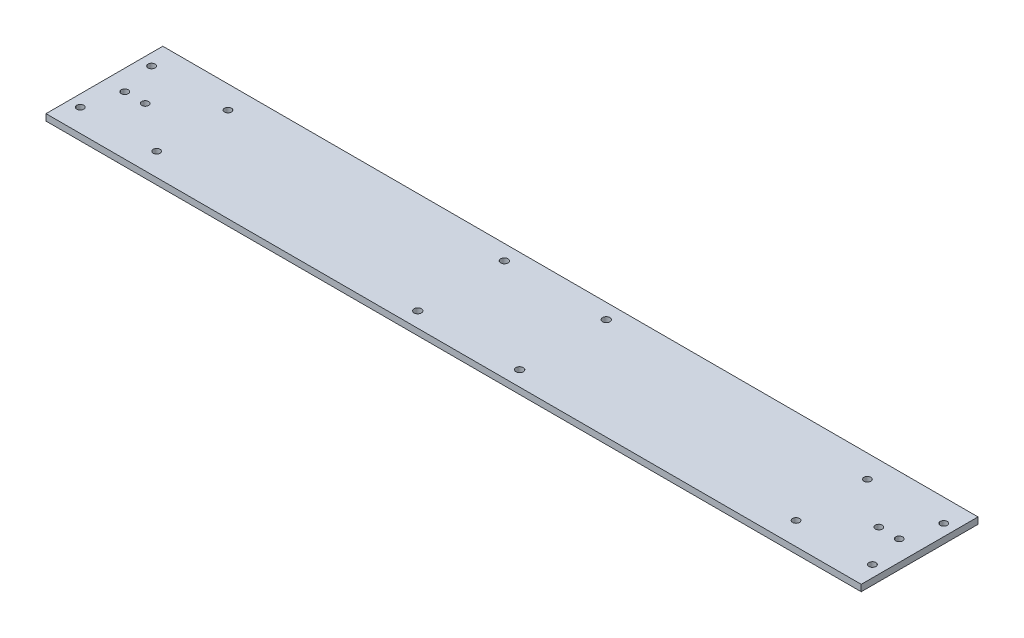
ISO-10303-21;
HEADER;
FILE_DESCRIPTION(('STEP AP214'),'2;1');
FILE_NAME('part.step','',(''),(''),'','','');
FILE_SCHEMA(('AUTOMOTIVE_DESIGN { 1 0 10303 214 1 1 1 1 }'));
ENDSEC;
DATA;
#1=APPLICATION_CONTEXT('core data for automotive mechanical design processes');
#2=APPLICATION_PROTOCOL_DEFINITION('international standard','automotive_design',2000,#1);
#3=PRODUCT_CONTEXT('',#1,'mechanical');
#4=PRODUCT('Part','Part','',(#3));
#5=PRODUCT_RELATED_PRODUCT_CATEGORY('part','',(#4));
#6=PRODUCT_DEFINITION_FORMATION('','',#4);
#7=PRODUCT_DEFINITION_CONTEXT('part definition',#1,'design');
#8=PRODUCT_DEFINITION('design','',#6,#7);
#9=PRODUCT_DEFINITION_SHAPE('','',#8);
#10=(LENGTH_UNIT() NAMED_UNIT(*) SI_UNIT(.MILLI.,.METRE.));
#11=(NAMED_UNIT(*) PLANE_ANGLE_UNIT() SI_UNIT($,.RADIAN.));
#12=(NAMED_UNIT(*) SI_UNIT($,.STERADIAN.) SOLID_ANGLE_UNIT());
#13=UNCERTAINTY_MEASURE_WITH_UNIT(LENGTH_MEASURE(1.E-05),#10,'distance_accuracy_value','');
#14=(GEOMETRIC_REPRESENTATION_CONTEXT(3) GLOBAL_UNCERTAINTY_ASSIGNED_CONTEXT((#13)) GLOBAL_UNIT_ASSIGNED_CONTEXT((#10,
#11,#12)) REPRESENTATION_CONTEXT('',''));
#15=CARTESIAN_POINT('',(0.,0.,0.));
#16=DIRECTION('',(0.,0.,1.));
#17=DIRECTION('',(1.,0.,0.));
#18=AXIS2_PLACEMENT_3D('',#15,#16,#17);
#19=CARTESIAN_POINT('',(200.,3.175,-28.65));
#20=DIRECTION('',(-1.,0.,0.));
#21=DIRECTION('',(0.,0.,1.));
#22=AXIS2_PLACEMENT_3D('',#19,#20,#21);
#23=PLANE('',#22);
#24=DIRECTION('',(0.,0.,-1.));
#25=VECTOR('',#24,1.);
#26=CARTESIAN_POINT('',(200.,0.,-28.65));
#27=LINE('',#26,#25);
#28=CARTESIAN_POINT('',(200.,0.,28.65));
#29=VERTEX_POINT('',#28);
#30=CARTESIAN_POINT('',(200.,0.,-28.65));
#31=VERTEX_POINT('',#30);
#32=EDGE_CURVE('E138',#29,#31,#27,.T.);
#33=ORIENTED_EDGE('',*,*,#32,.T.);
#34=DIRECTION('',(0.,-1.,0.));
#35=VECTOR('',#34,1.);
#36=CARTESIAN_POINT('',(200.,3.175,-28.65));
#37=LINE('',#36,#35);
#38=CARTESIAN_POINT('',(200.,3.175,-28.65));
#39=VERTEX_POINT('',#38);
#40=EDGE_CURVE('E12',#39,#31,#37,.T.);
#41=ORIENTED_EDGE('',*,*,#40,.F.);
#42=DIRECTION('',(0.,0.,-1.));
#43=VECTOR('',#42,1.);
#44=CARTESIAN_POINT('',(200.,3.175,-28.65));
#45=LINE('',#44,#43);
#46=CARTESIAN_POINT('',(200.,3.175,28.65));
#47=VERTEX_POINT('',#46);
#48=EDGE_CURVE('E100',#47,#39,#45,.T.);
#49=ORIENTED_EDGE('',*,*,#48,.F.);
#50=DIRECTION('',(0.,-1.,0.));
#51=VECTOR('',#50,1.);
#52=CARTESIAN_POINT('',(200.,3.175,28.65));
#53=LINE('',#52,#51);
#54=EDGE_CURVE('E115',#47,#29,#53,.T.);
#55=ORIENTED_EDGE('',*,*,#54,.T.);
#56=EDGE_LOOP('',(#33,#41,#49,#55));
#57=FACE_BOUND('',#56,.T.);
#58=ADVANCED_FACE('F41',(#57),#23,.F.);
#59=CARTESIAN_POINT('',(-200.,3.175,-28.65));
#60=DIRECTION('',(0.,0.,1.));
#61=DIRECTION('',(1.,0.,0.));
#62=AXIS2_PLACEMENT_3D('',#59,#60,#61);
#63=PLANE('',#62);
#64=DIRECTION('',(-1.,0.,0.));
#65=VECTOR('',#64,1.);
#66=CARTESIAN_POINT('',(-200.,0.,-28.65));
#67=LINE('',#66,#65);
#68=CARTESIAN_POINT('',(-200.,0.,-28.65));
#69=VERTEX_POINT('',#68);
#70=EDGE_CURVE('E105',#31,#69,#67,.T.);
#71=ORIENTED_EDGE('',*,*,#70,.T.);
#72=DIRECTION('',(0.,-1.,0.));
#73=VECTOR('',#72,1.);
#74=CARTESIAN_POINT('',(-200.,3.175,-28.65));
#75=LINE('',#74,#73);
#76=CARTESIAN_POINT('',(-200.,3.175,-28.65));
#77=VERTEX_POINT('',#76);
#78=EDGE_CURVE('E51',#77,#69,#75,.T.);
#79=ORIENTED_EDGE('',*,*,#78,.F.);
#80=DIRECTION('',(-1.,0.,0.));
#81=VECTOR('',#80,1.);
#82=CARTESIAN_POINT('',(-200.,3.175,-28.65));
#83=LINE('',#82,#81);
#84=EDGE_CURVE('E95',#39,#77,#83,.T.);
#85=ORIENTED_EDGE('',*,*,#84,.F.);
#86=ORIENTED_EDGE('',*,*,#40,.T.);
#87=EDGE_LOOP('',(#71,#79,#85,#86));
#88=FACE_BOUND('',#87,.T.);
#89=ADVANCED_FACE('F104',(#88),#63,.F.);
#90=CARTESIAN_POINT('',(-200.,3.175,-28.65));
#91=DIRECTION('',(1.,0.,0.));
#92=DIRECTION('',(0.,0.,-1.));
#93=AXIS2_PLACEMENT_3D('',#90,#91,#92);
#94=PLANE('',#93);
#95=DIRECTION('',(0.,0.,1.));
#96=VECTOR('',#95,1.);
#97=CARTESIAN_POINT('',(-200.,0.,-28.65));
#98=LINE('',#97,#96);
#99=CARTESIAN_POINT('',(-200.,0.,28.65));
#100=VERTEX_POINT('',#99);
#101=EDGE_CURVE('E81',#69,#100,#98,.T.);
#102=ORIENTED_EDGE('',*,*,#101,.T.);
#103=DIRECTION('',(0.,-1.,0.));
#104=VECTOR('',#103,1.);
#105=CARTESIAN_POINT('',(-200.,3.175,28.65));
#106=LINE('',#105,#104);
#107=CARTESIAN_POINT('',(-200.,3.175,28.65));
#108=VERTEX_POINT('',#107);
#109=EDGE_CURVE('E107',#108,#100,#106,.T.);
#110=ORIENTED_EDGE('',*,*,#109,.F.);
#111=DIRECTION('',(0.,0.,1.));
#112=VECTOR('',#111,1.);
#113=CARTESIAN_POINT('',(-200.,3.175,-28.65));
#114=LINE('',#113,#112);
#115=EDGE_CURVE('E98',#77,#108,#114,.T.);
#116=ORIENTED_EDGE('',*,*,#115,.F.);
#117=ORIENTED_EDGE('',*,*,#78,.T.);
#118=EDGE_LOOP('',(#102,#110,#116,#117));
#119=FACE_BOUND('',#118,.T.);
#120=ADVANCED_FACE('F109',(#119),#94,.F.);
#121=CARTESIAN_POINT('',(-200.,3.175,28.65));
#122=DIRECTION('',(0.,0.,-1.));
#123=DIRECTION('',(-1.,0.,0.));
#124=AXIS2_PLACEMENT_3D('',#121,#122,#123);
#125=PLANE('',#124);
#126=DIRECTION('',(1.,0.,0.));
#127=VECTOR('',#126,1.);
#128=CARTESIAN_POINT('',(-200.,0.,28.65));
#129=LINE('',#128,#127);
#130=EDGE_CURVE('E87',#100,#29,#129,.T.);
#131=ORIENTED_EDGE('',*,*,#130,.T.);
#132=ORIENTED_EDGE('',*,*,#54,.F.);
#133=DIRECTION('',(1.,0.,0.));
#134=VECTOR('',#133,1.);
#135=CARTESIAN_POINT('',(-200.,3.175,28.65));
#136=LINE('',#135,#134);
#137=EDGE_CURVE('E60',#108,#47,#136,.T.);
#138=ORIENTED_EDGE('',*,*,#137,.F.);
#139=ORIENTED_EDGE('',*,*,#109,.T.);
#140=EDGE_LOOP('',(#131,#132,#138,#139));
#141=FACE_BOUND('',#140,.T.);
#142=ADVANCED_FACE('F259',(#141),#125,.F.);
#143=CARTESIAN_POINT('',(0.,3.175,0.));
#144=DIRECTION('',(0.,1.,0.));
#145=DIRECTION('',(0.,0.,1.));
#146=AXIS2_PLACEMENT_3D('',#143,#144,#145);
#147=PLANE('',#146);
#148=CARTESIAN_POINT('',(25.,3.175,21.25));
#149=DIRECTION('',(0.,1.,0.));
#150=DIRECTION('',(0.,0.,1.));
#151=AXIS2_PLACEMENT_3D('',#148,#149,#150);
#152=CIRCLE('',#151,1.79999999999999);
#153=CARTESIAN_POINT('',(25.,3.175,23.05));
#154=VERTEX_POINT('',#153);
#155=EDGE_CURVE('E323',#154,#154,#152,.T.);
#156=ORIENTED_EDGE('',*,*,#155,.F.);
#157=EDGE_LOOP('',(#156));
#158=FACE_BOUND('',#157,.T.);
#159=CARTESIAN_POINT('',(-25.,3.175,-21.25));
#160=DIRECTION('',(0.,1.,0.));
#161=DIRECTION('',(0.,0.,1.));
#162=AXIS2_PLACEMENT_3D('',#159,#160,#161);
#163=CIRCLE('',#162,1.79999999999999);
#164=CARTESIAN_POINT('',(-25.,3.175,-19.45));
#165=VERTEX_POINT('',#164);
#166=EDGE_CURVE('E309',#165,#165,#163,.T.);
#167=ORIENTED_EDGE('',*,*,#166,.F.);
#168=EDGE_LOOP('',(#167));
#169=FACE_BOUND('',#168,.T.);
#170=CARTESIAN_POINT('',(-25.,3.175,21.25));
#171=DIRECTION('',(0.,1.,0.));
#172=DIRECTION('',(0.,0.,1.));
#173=AXIS2_PLACEMENT_3D('',#170,#171,#172);
#174=CIRCLE('',#173,1.79999999999999);
#175=CARTESIAN_POINT('',(-25.,3.175,23.05));
#176=VERTEX_POINT('',#175);
#177=EDGE_CURVE('E305',#176,#176,#174,.T.);
#178=ORIENTED_EDGE('',*,*,#177,.F.);
#179=EDGE_LOOP('',(#178));
#180=FACE_BOUND('',#179,.T.);
#181=CARTESIAN_POINT('',(25.,3.175,-21.25));
#182=DIRECTION('',(0.,1.,0.));
#183=DIRECTION('',(0.,0.,1.));
#184=AXIS2_PLACEMENT_3D('',#181,#182,#183);
#185=CIRCLE('',#184,1.79999999999999);
#186=CARTESIAN_POINT('',(25.,3.175,-19.45));
#187=VERTEX_POINT('',#186);
#188=EDGE_CURVE('E304',#187,#187,#185,.T.);
#189=ORIENTED_EDGE('',*,*,#188,.F.);
#190=EDGE_LOOP('',(#189));
#191=FACE_BOUND('',#190,.T.);
#192=CARTESIAN_POINT('',(194.33820754717,3.175,17.5));
#193=DIRECTION('',(0.,1.,0.));
#194=DIRECTION('',(0.,0.,1.));
#195=AXIS2_PLACEMENT_3D('',#192,#193,#194);
#196=CIRCLE('',#195,1.70000000000001);
#197=CARTESIAN_POINT('',(194.33820754717,3.175,19.2));
#198=VERTEX_POINT('',#197);
#199=EDGE_CURVE('E236',#198,#198,#196,.T.);
#200=ORIENTED_EDGE('',*,*,#199,.F.);
#201=EDGE_LOOP('',(#200));
#202=FACE_BOUND('',#201,.T.);
#203=CARTESIAN_POINT('',(156.86179245283,3.175,17.5));
#204=DIRECTION('',(0.,1.,0.));
#205=DIRECTION('',(0.,0.,1.));
#206=AXIS2_PLACEMENT_3D('',#203,#204,#205);
#207=CIRCLE('',#206,1.70000000000001);
#208=CARTESIAN_POINT('',(156.86179245283,3.175,19.2));
#209=VERTEX_POINT('',#208);
#210=EDGE_CURVE('E229',#209,#209,#207,.T.);
#211=ORIENTED_EDGE('',*,*,#210,.F.);
#212=EDGE_LOOP('',(#211));
#213=FACE_BOUND('',#212,.T.);
#214=CARTESIAN_POINT('',(156.86179245283,3.175,-17.5));
#215=DIRECTION('',(0.,1.,0.));
#216=DIRECTION('',(0.,0.,1.));
#217=AXIS2_PLACEMENT_3D('',#214,#215,#216);
#218=CIRCLE('',#217,1.70000000000001);
#219=CARTESIAN_POINT('',(156.86179245283,3.175,-15.8));
#220=VERTEX_POINT('',#219);
#221=EDGE_CURVE('E219',#220,#220,#218,.T.);
#222=ORIENTED_EDGE('',*,*,#221,.F.);
#223=EDGE_LOOP('',(#222));
#224=FACE_BOUND('',#223,.T.);
#225=CARTESIAN_POINT('',(-156.86179245283,3.175,-17.5));
#226=DIRECTION('',(0.,1.,0.));
#227=DIRECTION('',(0.,0.,1.));
#228=AXIS2_PLACEMENT_3D('',#225,#226,#227);
#229=CIRCLE('',#228,1.70000000000001);
#230=CARTESIAN_POINT('',(-156.86179245283,3.175,-15.8));
#231=VERTEX_POINT('',#230);
#232=EDGE_CURVE('E210',#231,#231,#229,.T.);
#233=ORIENTED_EDGE('',*,*,#232,.F.);
#234=EDGE_LOOP('',(#233));
#235=FACE_BOUND('',#234,.T.);
#236=CARTESIAN_POINT('',(-156.86179245283,3.175,17.5));
#237=DIRECTION('',(0.,1.,0.));
#238=DIRECTION('',(0.,0.,1.));
#239=AXIS2_PLACEMENT_3D('',#236,#237,#238);
#240=CIRCLE('',#239,1.70000000000001);
#241=CARTESIAN_POINT('',(-156.86179245283,3.175,19.2));
#242=VERTEX_POINT('',#241);
#243=EDGE_CURVE('E139',#242,#242,#240,.T.);
#244=ORIENTED_EDGE('',*,*,#243,.F.);
#245=EDGE_LOOP('',(#244));
#246=FACE_BOUND('',#245,.T.);
#247=CARTESIAN_POINT('',(-180.,3.175,3.97922587803469E-09));
#248=DIRECTION('',(0.,1.,0.));
#249=DIRECTION('',(0.,0.,1.));
#250=AXIS2_PLACEMENT_3D('',#247,#248,#249);
#251=CIRCLE('',#250,1.69999999999998);
#252=CARTESIAN_POINT('',(-180.,3.175,1.70000000397921));
#253=VERTEX_POINT('',#252);
#254=EDGE_CURVE('E155',#253,#253,#251,.T.);
#255=ORIENTED_EDGE('',*,*,#254,.F.);
#256=EDGE_LOOP('',(#255));
#257=FACE_BOUND('',#256,.T.);
#258=CARTESIAN_POINT('',(-190.,3.175,3.97922434722619E-09));
#259=DIRECTION('',(0.,1.,0.));
#260=DIRECTION('',(0.,0.,1.));
#261=AXIS2_PLACEMENT_3D('',#258,#259,#260);
#262=CIRCLE('',#261,1.69999999999998);
#263=CARTESIAN_POINT('',(-190.,3.175,1.70000000397921));
#264=VERTEX_POINT('',#263);
#265=EDGE_CURVE('E163',#264,#264,#262,.T.);
#266=ORIENTED_EDGE('',*,*,#265,.F.);
#267=EDGE_LOOP('',(#266));
#268=FACE_BOUND('',#267,.T.);
#269=CARTESIAN_POINT('',(-194.338207547169,3.175,-17.5));
#270=DIRECTION('',(0.,1.,0.));
#271=DIRECTION('',(0.,0.,1.));
#272=AXIS2_PLACEMENT_3D('',#269,#270,#271);
#273=CIRCLE('',#272,1.70000000000001);
#274=CARTESIAN_POINT('',(-194.338207547169,3.175,-15.8));
#275=VERTEX_POINT('',#274);
#276=EDGE_CURVE('E172',#275,#275,#273,.T.);
#277=ORIENTED_EDGE('',*,*,#276,.F.);
#278=EDGE_LOOP('',(#277));
#279=FACE_BOUND('',#278,.T.);
#280=CARTESIAN_POINT('',(180.,3.175,-3.97921373497036E-09));
#281=DIRECTION('',(0.,1.,0.));
#282=DIRECTION('',(0.,0.,1.));
#283=AXIS2_PLACEMENT_3D('',#280,#281,#282);
#284=CIRCLE('',#283,1.69999999999998);
#285=CARTESIAN_POINT('',(180.,3.175,1.69999999602077));
#286=VERTEX_POINT('',#285);
#287=EDGE_CURVE('E182',#286,#286,#284,.T.);
#288=ORIENTED_EDGE('',*,*,#287,.F.);
#289=EDGE_LOOP('',(#288));
#290=FACE_BOUND('',#289,.T.);
#291=CARTESIAN_POINT('',(190.,3.175,-3.97921220416186E-09));
#292=DIRECTION('',(0.,1.,0.));
#293=DIRECTION('',(0.,0.,1.));
#294=AXIS2_PLACEMENT_3D('',#291,#292,#293);
#295=CIRCLE('',#294,1.69999999999998);
#296=CARTESIAN_POINT('',(190.,3.175,1.69999999602077));
#297=VERTEX_POINT('',#296);
#298=EDGE_CURVE('E193',#297,#297,#295,.T.);
#299=ORIENTED_EDGE('',*,*,#298,.F.);
#300=EDGE_LOOP('',(#299));
#301=FACE_BOUND('',#300,.T.);
#302=CARTESIAN_POINT('',(194.33820754717,3.175,-17.5));
#303=DIRECTION('',(0.,1.,0.));
#304=DIRECTION('',(0.,0.,1.));
#305=AXIS2_PLACEMENT_3D('',#302,#303,#304);
#306=CIRCLE('',#305,1.70000000000001);
#307=CARTESIAN_POINT('',(194.33820754717,3.175,-15.8));
#308=VERTEX_POINT('',#307);
#309=EDGE_CURVE('E202',#308,#308,#306,.T.);
#310=ORIENTED_EDGE('',*,*,#309,.F.);
#311=EDGE_LOOP('',(#310));
#312=FACE_BOUND('',#311,.T.);
#313=CARTESIAN_POINT('',(-194.338207547169,3.175,17.5));
#314=DIRECTION('',(0.,1.,0.));
#315=DIRECTION('',(0.,0.,1.));
#316=AXIS2_PLACEMENT_3D('',#313,#314,#315);
#317=CIRCLE('',#316,1.70000000000001);
#318=CARTESIAN_POINT('',(-194.338207547169,3.175,19.2));
#319=VERTEX_POINT('',#318);
#320=EDGE_CURVE('E128',#319,#319,#317,.T.);
#321=ORIENTED_EDGE('',*,*,#320,.F.);
#322=EDGE_LOOP('',(#321));
#323=FACE_BOUND('',#322,.T.);
#324=ORIENTED_EDGE('',*,*,#48,.T.);
#325=ORIENTED_EDGE('',*,*,#84,.T.);
#326=ORIENTED_EDGE('',*,*,#115,.T.);
#327=ORIENTED_EDGE('',*,*,#137,.T.);
#328=EDGE_LOOP('',(#324,#325,#326,#327));
#329=FACE_BOUND('',#328,.T.);
#330=ADVANCED_FACE('F96',(#158,#169,#180,#191,#202,#213,#224,#235,#246,#257,#268,#279,#290,#301,
#312,#323,#329),#147,.T.);
#331=CARTESIAN_POINT('',(0.,0.,0.));
#332=DIRECTION('',(0.,1.,0.));
#333=DIRECTION('',(0.,0.,1.));
#334=AXIS2_PLACEMENT_3D('',#331,#332,#333);
#335=PLANE('',#334);
#336=CARTESIAN_POINT('',(25.,0.,21.25));
#337=DIRECTION('',(0.,1.,0.));
#338=DIRECTION('',(0.,0.,1.));
#339=AXIS2_PLACEMENT_3D('',#336,#337,#338);
#340=CIRCLE('',#339,1.79999999999999);
#341=CARTESIAN_POINT('',(25.,0.,23.05));
#342=VERTEX_POINT('',#341);
#343=EDGE_CURVE('E44',#342,#342,#340,.T.);
#344=ORIENTED_EDGE('',*,*,#343,.T.);
#345=EDGE_LOOP('',(#344));
#346=FACE_BOUND('',#345,.T.);
#347=CARTESIAN_POINT('',(-25.,0.,-21.25));
#348=DIRECTION('',(0.,1.,0.));
#349=DIRECTION('',(0.,0.,1.));
#350=AXIS2_PLACEMENT_3D('',#347,#348,#349);
#351=CIRCLE('',#350,1.79999999999999);
#352=CARTESIAN_POINT('',(-25.,0.,-19.45));
#353=VERTEX_POINT('',#352);
#354=EDGE_CURVE('E306',#353,#353,#351,.T.);
#355=ORIENTED_EDGE('',*,*,#354,.T.);
#356=EDGE_LOOP('',(#355));
#357=FACE_BOUND('',#356,.T.);
#358=CARTESIAN_POINT('',(-25.,0.,21.25));
#359=DIRECTION('',(0.,1.,0.));
#360=DIRECTION('',(0.,0.,1.));
#361=AXIS2_PLACEMENT_3D('',#358,#359,#360);
#362=CIRCLE('',#361,1.79999999999999);
#363=CARTESIAN_POINT('',(-25.,0.,23.05));
#364=VERTEX_POINT('',#363);
#365=EDGE_CURVE('E301',#364,#364,#362,.T.);
#366=ORIENTED_EDGE('',*,*,#365,.T.);
#367=EDGE_LOOP('',(#366));
#368=FACE_BOUND('',#367,.T.);
#369=CARTESIAN_POINT('',(25.,0.,-21.25));
#370=DIRECTION('',(0.,1.,0.));
#371=DIRECTION('',(0.,0.,1.));
#372=AXIS2_PLACEMENT_3D('',#369,#370,#371);
#373=CIRCLE('',#372,1.79999999999999);
#374=CARTESIAN_POINT('',(25.,0.,-19.45));
#375=VERTEX_POINT('',#374);
#376=EDGE_CURVE('E207',#375,#375,#373,.T.);
#377=ORIENTED_EDGE('',*,*,#376,.T.);
#378=EDGE_LOOP('',(#377));
#379=FACE_BOUND('',#378,.T.);
#380=CARTESIAN_POINT('',(194.33820754717,0.,17.5));
#381=DIRECTION('',(0.,1.,0.));
#382=DIRECTION('',(0.,0.,1.));
#383=AXIS2_PLACEMENT_3D('',#380,#381,#382);
#384=CIRCLE('',#383,1.70000000000001);
#385=CARTESIAN_POINT('',(194.33820754717,0.,19.2));
#386=VERTEX_POINT('',#385);
#387=EDGE_CURVE('E234',#386,#386,#384,.T.);
#388=ORIENTED_EDGE('',*,*,#387,.T.);
#389=EDGE_LOOP('',(#388));
#390=FACE_BOUND('',#389,.T.);
#391=CARTESIAN_POINT('',(156.86179245283,0.,17.5));
#392=DIRECTION('',(0.,1.,0.));
#393=DIRECTION('',(0.,0.,1.));
#394=AXIS2_PLACEMENT_3D('',#391,#392,#393);
#395=CIRCLE('',#394,1.70000000000001);
#396=CARTESIAN_POINT('',(156.86179245283,0.,19.2));
#397=VERTEX_POINT('',#396);
#398=EDGE_CURVE('E224',#397,#397,#395,.T.);
#399=ORIENTED_EDGE('',*,*,#398,.T.);
#400=EDGE_LOOP('',(#399));
#401=FACE_BOUND('',#400,.T.);
#402=CARTESIAN_POINT('',(156.86179245283,0.,-17.5));
#403=DIRECTION('',(0.,1.,0.));
#404=DIRECTION('',(0.,0.,1.));
#405=AXIS2_PLACEMENT_3D('',#402,#403,#404);
#406=CIRCLE('',#405,1.70000000000001);
#407=CARTESIAN_POINT('',(156.86179245283,0.,-15.8));
#408=VERTEX_POINT('',#407);
#409=EDGE_CURVE('E215',#408,#408,#406,.T.);
#410=ORIENTED_EDGE('',*,*,#409,.T.);
#411=EDGE_LOOP('',(#410));
#412=FACE_BOUND('',#411,.T.);
#413=CARTESIAN_POINT('',(-156.86179245283,0.,-17.5));
#414=DIRECTION('',(0.,1.,0.));
#415=DIRECTION('',(0.,0.,1.));
#416=AXIS2_PLACEMENT_3D('',#413,#414,#415);
#417=CIRCLE('',#416,1.70000000000001);
#418=CARTESIAN_POINT('',(-156.86179245283,0.,-15.8));
#419=VERTEX_POINT('',#418);
#420=EDGE_CURVE('E145',#419,#419,#417,.T.);
#421=ORIENTED_EDGE('',*,*,#420,.T.);
#422=EDGE_LOOP('',(#421));
#423=FACE_BOUND('',#422,.T.);
#424=CARTESIAN_POINT('',(-156.86179245283,0.,17.5));
#425=DIRECTION('',(0.,1.,0.));
#426=DIRECTION('',(0.,0.,1.));
#427=AXIS2_PLACEMENT_3D('',#424,#425,#426);
#428=CIRCLE('',#427,1.70000000000001);
#429=CARTESIAN_POINT('',(-156.86179245283,0.,19.2));
#430=VERTEX_POINT('',#429);
#431=EDGE_CURVE('E144',#430,#430,#428,.T.);
#432=ORIENTED_EDGE('',*,*,#431,.T.);
#433=EDGE_LOOP('',(#432));
#434=FACE_BOUND('',#433,.T.);
#435=CARTESIAN_POINT('',(-180.,0.,3.97922587803469E-09));
#436=DIRECTION('',(0.,1.,0.));
#437=DIRECTION('',(0.,0.,1.));
#438=AXIS2_PLACEMENT_3D('',#435,#436,#437);
#439=CIRCLE('',#438,1.69999999999998);
#440=CARTESIAN_POINT('',(-180.,0.,1.70000000397921));
#441=VERTEX_POINT('',#440);
#442=EDGE_CURVE('E160',#441,#441,#439,.T.);
#443=ORIENTED_EDGE('',*,*,#442,.T.);
#444=EDGE_LOOP('',(#443));
#445=FACE_BOUND('',#444,.T.);
#446=CARTESIAN_POINT('',(-190.,0.,3.97922434722619E-09));
#447=DIRECTION('',(0.,1.,0.));
#448=DIRECTION('',(0.,0.,1.));
#449=AXIS2_PLACEMENT_3D('',#446,#447,#448);
#450=CIRCLE('',#449,1.69999999999998);
#451=CARTESIAN_POINT('',(-190.,0.,1.70000000397921));
#452=VERTEX_POINT('',#451);
#453=EDGE_CURVE('E168',#452,#452,#450,.T.);
#454=ORIENTED_EDGE('',*,*,#453,.T.);
#455=EDGE_LOOP('',(#454));
#456=FACE_BOUND('',#455,.T.);
#457=CARTESIAN_POINT('',(-194.338207547169,0.,-17.5));
#458=DIRECTION('',(0.,1.,0.));
#459=DIRECTION('',(0.,0.,1.));
#460=AXIS2_PLACEMENT_3D('',#457,#458,#459);
#461=CIRCLE('',#460,1.70000000000001);
#462=CARTESIAN_POINT('',(-194.338207547169,0.,-15.8));
#463=VERTEX_POINT('',#462);
#464=EDGE_CURVE('E134',#463,#463,#461,.T.);
#465=ORIENTED_EDGE('',*,*,#464,.T.);
#466=EDGE_LOOP('',(#465));
#467=FACE_BOUND('',#466,.T.);
#468=CARTESIAN_POINT('',(180.,0.,-3.97921373497036E-09));
#469=DIRECTION('',(0.,1.,0.));
#470=DIRECTION('',(0.,0.,1.));
#471=AXIS2_PLACEMENT_3D('',#468,#469,#470);
#472=CIRCLE('',#471,1.69999999999998);
#473=CARTESIAN_POINT('',(180.,0.,1.69999999602077));
#474=VERTEX_POINT('',#473);
#475=EDGE_CURVE('E188',#474,#474,#472,.T.);
#476=ORIENTED_EDGE('',*,*,#475,.T.);
#477=EDGE_LOOP('',(#476));
#478=FACE_BOUND('',#477,.T.);
#479=CARTESIAN_POINT('',(190.,0.,-3.97921220416186E-09));
#480=DIRECTION('',(0.,1.,0.));
#481=DIRECTION('',(0.,0.,1.));
#482=AXIS2_PLACEMENT_3D('',#479,#480,#481);
#483=CIRCLE('',#482,1.69999999999998);
#484=CARTESIAN_POINT('',(190.,0.,1.69999999602077));
#485=VERTEX_POINT('',#484);
#486=EDGE_CURVE('E189',#485,#485,#483,.T.);
#487=ORIENTED_EDGE('',*,*,#486,.T.);
#488=EDGE_LOOP('',(#487));
#489=FACE_BOUND('',#488,.T.);
#490=CARTESIAN_POINT('',(194.33820754717,0.,-17.5));
#491=DIRECTION('',(0.,1.,0.));
#492=DIRECTION('',(0.,0.,1.));
#493=AXIS2_PLACEMENT_3D('',#490,#491,#492);
#494=CIRCLE('',#493,1.70000000000001);
#495=CARTESIAN_POINT('',(194.33820754717,0.,-15.8));
#496=VERTEX_POINT('',#495);
#497=EDGE_CURVE('E198',#496,#496,#494,.T.);
#498=ORIENTED_EDGE('',*,*,#497,.T.);
#499=EDGE_LOOP('',(#498));
#500=FACE_BOUND('',#499,.T.);
#501=CARTESIAN_POINT('',(-194.338207547169,0.,17.5));
#502=DIRECTION('',(0.,1.,0.));
#503=DIRECTION('',(0.,0.,1.));
#504=AXIS2_PLACEMENT_3D('',#501,#502,#503);
#505=CIRCLE('',#504,1.70000000000001);
#506=CARTESIAN_POINT('',(-194.338207547169,0.,19.2));
#507=VERTEX_POINT('',#506);
#508=EDGE_CURVE('E133',#507,#507,#505,.T.);
#509=ORIENTED_EDGE('',*,*,#508,.T.);
#510=EDGE_LOOP('',(#509));
#511=FACE_BOUND('',#510,.T.);
#512=ORIENTED_EDGE('',*,*,#32,.F.);
#513=ORIENTED_EDGE('',*,*,#130,.F.);
#514=ORIENTED_EDGE('',*,*,#101,.F.);
#515=ORIENTED_EDGE('',*,*,#70,.F.);
#516=EDGE_LOOP('',(#512,#513,#514,#515));
#517=FACE_BOUND('',#516,.T.);
#518=ADVANCED_FACE('F246',(#346,#357,#368,#379,#390,#401,#412,#423,#434,#445,#456,#467,#478,
#489,#500,#511,#517),#335,.F.);
#519=CARTESIAN_POINT('',(-194.338207547169,0.,17.5));
#520=DIRECTION('',(0.,1.,0.));
#521=DIRECTION('',(0.,0.,1.));
#522=AXIS2_PLACEMENT_3D('',#519,#520,#521);
#523=CYLINDRICAL_SURFACE('',#522,1.70000000000001);
#524=ORIENTED_EDGE('',*,*,#508,.F.);
#525=EDGE_LOOP('',(#524));
#526=FACE_BOUND('',#525,.T.);
#527=ORIENTED_EDGE('',*,*,#320,.T.);
#528=EDGE_LOOP('',(#527));
#529=FACE_BOUND('',#528,.T.);
#530=ADVANCED_FACE('F268',(#526,#529),#523,.F.);
#531=CARTESIAN_POINT('',(194.33820754717,0.,-17.5));
#532=DIRECTION('',(0.,1.,0.));
#533=DIRECTION('',(0.,0.,1.));
#534=AXIS2_PLACEMENT_3D('',#531,#532,#533);
#535=CYLINDRICAL_SURFACE('',#534,1.70000000000001);
#536=ORIENTED_EDGE('',*,*,#497,.F.);
#537=EDGE_LOOP('',(#536));
#538=FACE_BOUND('',#537,.T.);
#539=ORIENTED_EDGE('',*,*,#309,.T.);
#540=EDGE_LOOP('',(#539));
#541=FACE_BOUND('',#540,.T.);
#542=ADVANCED_FACE('F270',(#538,#541),#535,.F.);
#543=CARTESIAN_POINT('',(190.,0.,-3.97921220416186E-09));
#544=DIRECTION('',(0.,1.,0.));
#545=DIRECTION('',(0.,0.,1.));
#546=AXIS2_PLACEMENT_3D('',#543,#544,#545);
#547=CYLINDRICAL_SURFACE('',#546,1.69999999999998);
#548=ORIENTED_EDGE('',*,*,#486,.F.);
#549=EDGE_LOOP('',(#548));
#550=FACE_BOUND('',#549,.T.);
#551=ORIENTED_EDGE('',*,*,#298,.T.);
#552=EDGE_LOOP('',(#551));
#553=FACE_BOUND('',#552,.T.);
#554=ADVANCED_FACE('F253',(#550,#553),#547,.F.);
#555=CARTESIAN_POINT('',(180.,0.,-3.97921373497036E-09));
#556=DIRECTION('',(0.,1.,0.));
#557=DIRECTION('',(0.,0.,1.));
#558=AXIS2_PLACEMENT_3D('',#555,#556,#557);
#559=CYLINDRICAL_SURFACE('',#558,1.69999999999998);
#560=ORIENTED_EDGE('',*,*,#475,.F.);
#561=EDGE_LOOP('',(#560));
#562=FACE_BOUND('',#561,.T.);
#563=ORIENTED_EDGE('',*,*,#287,.T.);
#564=EDGE_LOOP('',(#563));
#565=FACE_BOUND('',#564,.T.);
#566=ADVANCED_FACE('F249',(#562,#565),#559,.F.);
#567=CARTESIAN_POINT('',(-194.338207547169,0.,-17.5));
#568=DIRECTION('',(0.,1.,0.));
#569=DIRECTION('',(0.,0.,1.));
#570=AXIS2_PLACEMENT_3D('',#567,#568,#569);
#571=CYLINDRICAL_SURFACE('',#570,1.70000000000001);
#572=ORIENTED_EDGE('',*,*,#464,.F.);
#573=EDGE_LOOP('',(#572));
#574=FACE_BOUND('',#573,.T.);
#575=ORIENTED_EDGE('',*,*,#276,.T.);
#576=EDGE_LOOP('',(#575));
#577=FACE_BOUND('',#576,.T.);
#578=ADVANCED_FACE('F252',(#574,#577),#571,.F.);
#579=CARTESIAN_POINT('',(-190.,0.,3.97922434722619E-09));
#580=DIRECTION('',(0.,1.,0.));
#581=DIRECTION('',(0.,0.,1.));
#582=AXIS2_PLACEMENT_3D('',#579,#580,#581);
#583=CYLINDRICAL_SURFACE('',#582,1.69999999999998);
#584=ORIENTED_EDGE('',*,*,#453,.F.);
#585=EDGE_LOOP('',(#584));
#586=FACE_BOUND('',#585,.T.);
#587=ORIENTED_EDGE('',*,*,#265,.T.);
#588=EDGE_LOOP('',(#587));
#589=FACE_BOUND('',#588,.T.);
#590=ADVANCED_FACE('F375',(#586,#589),#583,.F.);
#591=CARTESIAN_POINT('',(-180.,0.,3.97922587803469E-09));
#592=DIRECTION('',(0.,1.,0.));
#593=DIRECTION('',(0.,0.,1.));
#594=AXIS2_PLACEMENT_3D('',#591,#592,#593);
#595=CYLINDRICAL_SURFACE('',#594,1.69999999999998);
#596=ORIENTED_EDGE('',*,*,#442,.F.);
#597=EDGE_LOOP('',(#596));
#598=FACE_BOUND('',#597,.T.);
#599=ORIENTED_EDGE('',*,*,#254,.T.);
#600=EDGE_LOOP('',(#599));
#601=FACE_BOUND('',#600,.T.);
#602=ADVANCED_FACE('F379',(#598,#601),#595,.F.);
#603=CARTESIAN_POINT('',(-156.86179245283,0.,17.5));
#604=DIRECTION('',(0.,1.,0.));
#605=DIRECTION('',(0.,0.,1.));
#606=AXIS2_PLACEMENT_3D('',#603,#604,#605);
#607=CYLINDRICAL_SURFACE('',#606,1.70000000000001);
#608=ORIENTED_EDGE('',*,*,#431,.F.);
#609=EDGE_LOOP('',(#608));
#610=FACE_BOUND('',#609,.T.);
#611=ORIENTED_EDGE('',*,*,#243,.T.);
#612=EDGE_LOOP('',(#611));
#613=FACE_BOUND('',#612,.T.);
#614=ADVANCED_FACE('F365',(#610,#613),#607,.F.);
#615=CARTESIAN_POINT('',(-156.86179245283,0.,-17.5));
#616=DIRECTION('',(0.,1.,0.));
#617=DIRECTION('',(0.,0.,1.));
#618=AXIS2_PLACEMENT_3D('',#615,#616,#617);
#619=CYLINDRICAL_SURFACE('',#618,1.70000000000001);
#620=ORIENTED_EDGE('',*,*,#420,.F.);
#621=EDGE_LOOP('',(#620));
#622=FACE_BOUND('',#621,.T.);
#623=ORIENTED_EDGE('',*,*,#232,.T.);
#624=EDGE_LOOP('',(#623));
#625=FACE_BOUND('',#624,.T.);
#626=ADVANCED_FACE('F361',(#622,#625),#619,.F.);
#627=CARTESIAN_POINT('',(156.86179245283,0.,-17.5));
#628=DIRECTION('',(0.,1.,0.));
#629=DIRECTION('',(0.,0.,1.));
#630=AXIS2_PLACEMENT_3D('',#627,#628,#629);
#631=CYLINDRICAL_SURFACE('',#630,1.70000000000001);
#632=ORIENTED_EDGE('',*,*,#409,.F.);
#633=EDGE_LOOP('',(#632));
#634=FACE_BOUND('',#633,.T.);
#635=ORIENTED_EDGE('',*,*,#221,.T.);
#636=EDGE_LOOP('',(#635));
#637=FACE_BOUND('',#636,.T.);
#638=ADVANCED_FACE('F364',(#634,#637),#631,.F.);
#639=CARTESIAN_POINT('',(156.86179245283,0.,17.5));
#640=DIRECTION('',(0.,1.,0.));
#641=DIRECTION('',(0.,0.,1.));
#642=AXIS2_PLACEMENT_3D('',#639,#640,#641);
#643=CYLINDRICAL_SURFACE('',#642,1.70000000000001);
#644=ORIENTED_EDGE('',*,*,#398,.F.);
#645=EDGE_LOOP('',(#644));
#646=FACE_BOUND('',#645,.T.);
#647=ORIENTED_EDGE('',*,*,#210,.T.);
#648=EDGE_LOOP('',(#647));
#649=FACE_BOUND('',#648,.T.);
#650=ADVANCED_FACE('F353',(#646,#649),#643,.F.);
#651=CARTESIAN_POINT('',(194.33820754717,0.,17.5));
#652=DIRECTION('',(0.,1.,0.));
#653=DIRECTION('',(0.,0.,1.));
#654=AXIS2_PLACEMENT_3D('',#651,#652,#653);
#655=CYLINDRICAL_SURFACE('',#654,1.70000000000001);
#656=ORIENTED_EDGE('',*,*,#387,.F.);
#657=EDGE_LOOP('',(#656));
#658=FACE_BOUND('',#657,.T.);
#659=ORIENTED_EDGE('',*,*,#199,.T.);
#660=EDGE_LOOP('',(#659));
#661=FACE_BOUND('',#660,.T.);
#662=ADVANCED_FACE('F343',(#658,#661),#655,.F.);
#663=CARTESIAN_POINT('',(25.,3.175,-21.25));
#664=DIRECTION('',(0.,1.,0.));
#665=DIRECTION('',(0.,0.,1.));
#666=AXIS2_PLACEMENT_3D('',#663,#664,#665);
#667=CYLINDRICAL_SURFACE('',#666,1.79999999999999);
#668=ORIENTED_EDGE('',*,*,#188,.T.);
#669=EDGE_LOOP('',(#668));
#670=FACE_BOUND('',#669,.T.);
#671=ORIENTED_EDGE('',*,*,#376,.F.);
#672=EDGE_LOOP('',(#671));
#673=FACE_BOUND('',#672,.T.);
#674=ADVANCED_FACE('F340',(#670,#673),#667,.F.);
#675=CARTESIAN_POINT('',(-25.,3.175,21.25));
#676=DIRECTION('',(0.,1.,0.));
#677=DIRECTION('',(0.,0.,1.));
#678=AXIS2_PLACEMENT_3D('',#675,#676,#677);
#679=CYLINDRICAL_SURFACE('',#678,1.79999999999999);
#680=ORIENTED_EDGE('',*,*,#177,.T.);
#681=EDGE_LOOP('',(#680));
#682=FACE_BOUND('',#681,.T.);
#683=ORIENTED_EDGE('',*,*,#365,.F.);
#684=EDGE_LOOP('',(#683));
#685=FACE_BOUND('',#684,.T.);
#686=ADVANCED_FACE('F342',(#682,#685),#679,.F.);
#687=CARTESIAN_POINT('',(-25.,3.175,-21.25));
#688=DIRECTION('',(0.,1.,0.));
#689=DIRECTION('',(0.,0.,1.));
#690=AXIS2_PLACEMENT_3D('',#687,#688,#689);
#691=CYLINDRICAL_SURFACE('',#690,1.79999999999999);
#692=ORIENTED_EDGE('',*,*,#166,.T.);
#693=EDGE_LOOP('',(#692));
#694=FACE_BOUND('',#693,.T.);
#695=ORIENTED_EDGE('',*,*,#354,.F.);
#696=EDGE_LOOP('',(#695));
#697=FACE_BOUND('',#696,.T.);
#698=ADVANCED_FACE('F350',(#694,#697),#691,.F.);
#699=CARTESIAN_POINT('',(25.,3.175,21.25));
#700=DIRECTION('',(0.,1.,0.));
#701=DIRECTION('',(0.,0.,1.));
#702=AXIS2_PLACEMENT_3D('',#699,#700,#701);
#703=CYLINDRICAL_SURFACE('',#702,1.79999999999999);
#704=ORIENTED_EDGE('',*,*,#155,.T.);
#705=EDGE_LOOP('',(#704));
#706=FACE_BOUND('',#705,.T.);
#707=ORIENTED_EDGE('',*,*,#343,.F.);
#708=EDGE_LOOP('',(#707));
#709=FACE_BOUND('',#708,.T.);
#710=ADVANCED_FACE('F458',(#706,#709),#703,.F.);
#711=CLOSED_SHELL('',(#58,#89,#120,#142,#330,#518,#530,#542,#554,#566,#578,#590,#602,#614,#626,
#638,#650,#662,#674,#686,#698,#710));
#712=MANIFOLD_SOLID_BREP('B2',#711);
#713=ADVANCED_BREP_SHAPE_REPRESENTATION('',(#18,#712),#14);
#714=SHAPE_DEFINITION_REPRESENTATION(#9,#713);
ENDSEC;
END-ISO-10303-21;
